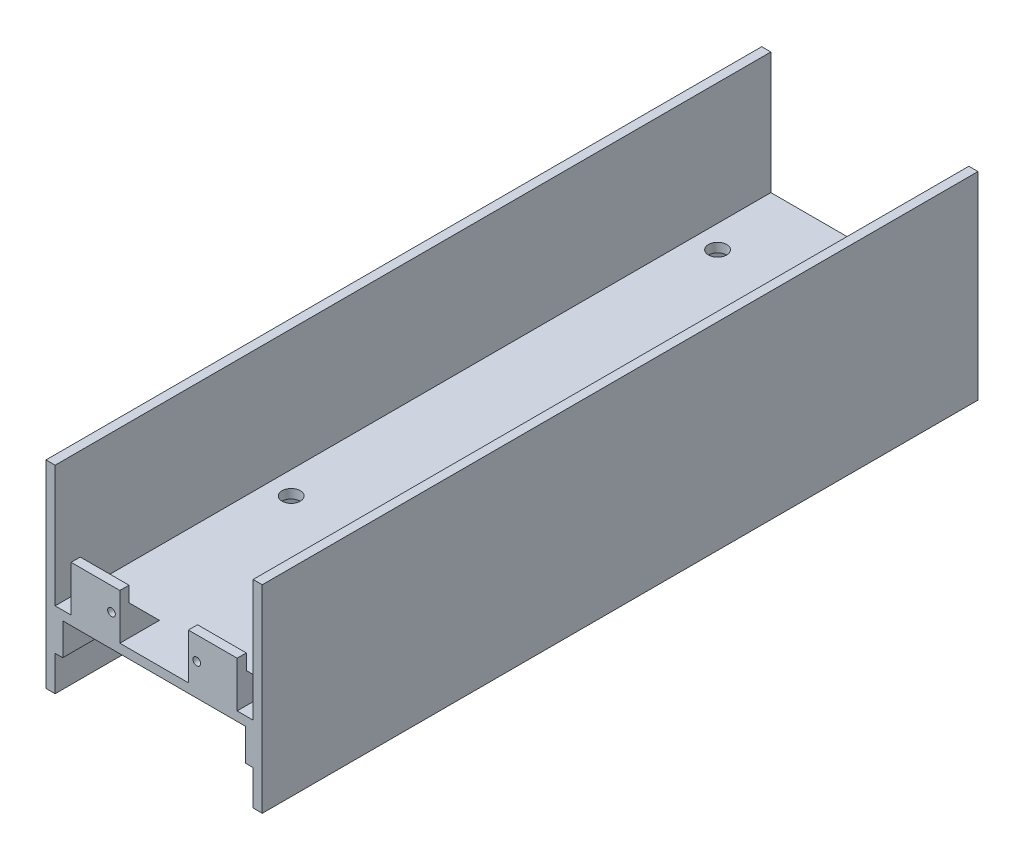
ISO-10303-21;
HEADER;
FILE_DESCRIPTION(('STEP AP214'),'2;1');
FILE_NAME('part.step','',(''),(''),'','','');
FILE_SCHEMA(('AUTOMOTIVE_DESIGN { 1 0 10303 214 1 1 1 1 }'));
ENDSEC;
DATA;
#1=APPLICATION_CONTEXT('core data for automotive mechanical design processes');
#2=APPLICATION_PROTOCOL_DEFINITION('international standard','automotive_design',2000,#1);
#3=PRODUCT_CONTEXT('',#1,'mechanical');
#4=PRODUCT('Part','Part','',(#3));
#5=PRODUCT_RELATED_PRODUCT_CATEGORY('part','',(#4));
#6=PRODUCT_DEFINITION_FORMATION('','',#4);
#7=PRODUCT_DEFINITION_CONTEXT('part definition',#1,'design');
#8=PRODUCT_DEFINITION('design','',#6,#7);
#9=PRODUCT_DEFINITION_SHAPE('','',#8);
#10=(LENGTH_UNIT() NAMED_UNIT(*) SI_UNIT(.MILLI.,.METRE.));
#11=(NAMED_UNIT(*) PLANE_ANGLE_UNIT() SI_UNIT($,.RADIAN.));
#12=(NAMED_UNIT(*) SI_UNIT($,.STERADIAN.) SOLID_ANGLE_UNIT());
#13=UNCERTAINTY_MEASURE_WITH_UNIT(LENGTH_MEASURE(1.E-05),#10,'distance_accuracy_value','');
#14=(GEOMETRIC_REPRESENTATION_CONTEXT(3) GLOBAL_UNCERTAINTY_ASSIGNED_CONTEXT((#13)) GLOBAL_UNIT_ASSIGNED_CONTEXT((#10,
#11,#12)) REPRESENTATION_CONTEXT('',''));
#15=CARTESIAN_POINT('',(0.,0.,0.));
#16=DIRECTION('',(0.,0.,1.));
#17=DIRECTION('',(1.,0.,0.));
#18=AXIS2_PLACEMENT_3D('',#15,#16,#17);
#19=CARTESIAN_POINT('',(-32.5,26.5,82.));
#20=DIRECTION('',(0.,-1.,0.));
#21=DIRECTION('',(0.,0.,-1.));
#22=AXIS2_PLACEMENT_3D('',#19,#20,#21);
#23=PLANE('',#22);
#24=CARTESIAN_POINT('',(-25.,26.5,12.));
#25=DIRECTION('',(0.,1.,0.));
#26=DIRECTION('',(0.,0.,1.));
#27=AXIS2_PLACEMENT_3D('',#24,#25,#26);
#28=CIRCLE('',#27,3.);
#29=CARTESIAN_POINT('',(-25.,26.5,15.));
#30=VERTEX_POINT('',#29);
#31=EDGE_CURVE('E859',#30,#30,#28,.T.);
#32=ORIENTED_EDGE('',*,*,#31,.F.);
#33=EDGE_LOOP('',(#32));
#34=FACE_BOUND('',#33,.T.);
#35=CARTESIAN_POINT('',(25.,26.5,12.));
#36=DIRECTION('',(0.,1.,0.));
#37=DIRECTION('',(0.,0.,1.));
#38=AXIS2_PLACEMENT_3D('',#35,#36,#37);
#39=CIRCLE('',#38,3.);
#40=CARTESIAN_POINT('',(25.,26.5,15.));
#41=VERTEX_POINT('',#40);
#42=EDGE_CURVE('E855',#41,#41,#39,.T.);
#43=ORIENTED_EDGE('',*,*,#42,.F.);
#44=EDGE_LOOP('',(#43));
#45=FACE_BOUND('',#44,.T.);
#46=CARTESIAN_POINT('',(25.,26.5,-128.));
#47=DIRECTION('',(0.,1.,0.));
#48=DIRECTION('',(0.,0.,1.));
#49=AXIS2_PLACEMENT_3D('',#46,#47,#48);
#50=CIRCLE('',#49,3.);
#51=CARTESIAN_POINT('',(25.,26.5,-125.));
#52=VERTEX_POINT('',#51);
#53=EDGE_CURVE('E603',#52,#52,#50,.T.);
#54=ORIENTED_EDGE('',*,*,#53,.F.);
#55=EDGE_LOOP('',(#54));
#56=FACE_BOUND('',#55,.T.);
#57=CARTESIAN_POINT('',(-25.,26.5,-128.));
#58=DIRECTION('',(0.,1.,0.));
#59=DIRECTION('',(0.,0.,1.));
#60=AXIS2_PLACEMENT_3D('',#57,#58,#59);
#61=CIRCLE('',#60,3.);
#62=CARTESIAN_POINT('',(-25.,26.5,-125.));
#63=VERTEX_POINT('',#62);
#64=EDGE_CURVE('E407',#63,#63,#61,.T.);
#65=ORIENTED_EDGE('',*,*,#64,.F.);
#66=EDGE_LOOP('',(#65));
#67=FACE_BOUND('',#66,.T.);
#68=DIRECTION('',(0.,0.,1.));
#69=VECTOR('',#68,1.);
#70=CARTESIAN_POINT('',(11.25,26.5,82.));
#71=LINE('',#70,#69);
#72=CARTESIAN_POINT('',(11.25,26.5,69.));
#73=VERTEX_POINT('',#72);
#74=CARTESIAN_POINT('',(11.25,26.5,82.));
#75=VERTEX_POINT('',#74);
#76=EDGE_CURVE('E236',#73,#75,#71,.T.);
#77=ORIENTED_EDGE('',*,*,#76,.F.);
#78=DIRECTION('',(1.,0.,0.));
#79=VECTOR('',#78,1.);
#80=CARTESIAN_POINT('',(27.25,26.5,69.));
#81=LINE('',#80,#79);
#82=CARTESIAN_POINT('',(27.25,26.5,69.));
#83=VERTEX_POINT('',#82);
#84=EDGE_CURVE('E386',#73,#83,#81,.T.);
#85=ORIENTED_EDGE('',*,*,#84,.T.);
#86=DIRECTION('',(0.,0.,-1.));
#87=VECTOR('',#86,1.);
#88=CARTESIAN_POINT('',(27.25,26.5,79.));
#89=LINE('',#88,#87);
#90=CARTESIAN_POINT('',(27.25,26.5,82.));
#91=VERTEX_POINT('',#90);
#92=EDGE_CURVE('E232',#91,#83,#89,.T.);
#93=ORIENTED_EDGE('',*,*,#92,.F.);
#94=DIRECTION('',(-1.,0.,0.));
#95=VECTOR('',#94,1.);
#96=CARTESIAN_POINT('',(-32.5,26.5,82.));
#97=LINE('',#96,#95);
#98=CARTESIAN_POINT('',(32.5,26.5,82.));
#99=VERTEX_POINT('',#98);
#100=EDGE_CURVE('E339',#99,#91,#97,.T.);
#101=ORIENTED_EDGE('',*,*,#100,.F.);
#102=DIRECTION('',(0.,0.,-1.));
#103=VECTOR('',#102,1.);
#104=CARTESIAN_POINT('',(32.5,26.5,82.));
#105=LINE('',#104,#103);
#106=CARTESIAN_POINT('',(32.5,26.5,-153.));
#107=VERTEX_POINT('',#106);
#108=EDGE_CURVE('E356',#99,#107,#105,.T.);
#109=ORIENTED_EDGE('',*,*,#108,.T.);
#110=DIRECTION('',(-1.,0.,0.));
#111=VECTOR('',#110,1.);
#112=CARTESIAN_POINT('',(-32.5,26.5,-153.));
#113=LINE('',#112,#111);
#114=CARTESIAN_POINT('',(-32.5,26.5,-153.));
#115=VERTEX_POINT('',#114);
#116=EDGE_CURVE('E302',#107,#115,#113,.T.);
#117=ORIENTED_EDGE('',*,*,#116,.T.);
#118=DIRECTION('',(0.,0.,-1.));
#119=VECTOR('',#118,1.);
#120=CARTESIAN_POINT('',(-32.5,26.5,82.));
#121=LINE('',#120,#119);
#122=CARTESIAN_POINT('',(-32.5,26.5,82.));
#123=VERTEX_POINT('',#122);
#124=EDGE_CURVE('E354',#123,#115,#121,.T.);
#125=ORIENTED_EDGE('',*,*,#124,.F.);
#126=CARTESIAN_POINT('',(-27.25,26.5,82.));
#127=VERTEX_POINT('',#126);
#128=EDGE_CURVE('E338',#127,#123,#97,.T.);
#129=ORIENTED_EDGE('',*,*,#128,.F.);
#130=DIRECTION('',(0.,0.,1.));
#131=VECTOR('',#130,1.);
#132=CARTESIAN_POINT('',(-27.25,26.5,79.));
#133=LINE('',#132,#131);
#134=CARTESIAN_POINT('',(-27.25,26.5,69.));
#135=VERTEX_POINT('',#134);
#136=EDGE_CURVE('E237',#135,#127,#133,.T.);
#137=ORIENTED_EDGE('',*,*,#136,.F.);
#138=DIRECTION('',(1.,0.,0.));
#139=VECTOR('',#138,1.);
#140=CARTESIAN_POINT('',(-11.25,26.5,69.));
#141=LINE('',#140,#139);
#142=CARTESIAN_POINT('',(-11.25,26.5,69.));
#143=VERTEX_POINT('',#142);
#144=EDGE_CURVE('E383',#135,#143,#141,.T.);
#145=ORIENTED_EDGE('',*,*,#144,.T.);
#146=DIRECTION('',(0.,0.,-1.));
#147=VECTOR('',#146,1.);
#148=CARTESIAN_POINT('',(-11.25,26.5,82.));
#149=LINE('',#148,#147);
#150=CARTESIAN_POINT('',(-11.25,26.5,82.));
#151=VERTEX_POINT('',#150);
#152=EDGE_CURVE('E239',#151,#143,#149,.T.);
#153=ORIENTED_EDGE('',*,*,#152,.F.);
#154=EDGE_CURVE('E342',#75,#151,#97,.T.);
#155=ORIENTED_EDGE('',*,*,#154,.F.);
#156=EDGE_LOOP('',(#77,#85,#93,#101,#109,#117,#125,#129,#137,#145,#153,#155));
#157=FACE_BOUND('',#156,.T.);
#158=ADVANCED_FACE('F35',(#34,#45,#56,#67,#157),#23,.F.);
#159=CARTESIAN_POINT('',(-32.5,1.5,82.));
#160=DIRECTION('',(0.,1.,0.));
#161=DIRECTION('',(-1.,0.,0.));
#162=AXIS2_PLACEMENT_3D('',#159,#160,#161);
#163=PLANE('',#162);
#164=DIRECTION('',(0.,0.,-1.));
#165=VECTOR('',#164,1.);
#166=CARTESIAN_POINT('',(-35.5,1.5,82.));
#167=LINE('',#166,#165);
#168=CARTESIAN_POINT('',(-35.5,1.5,82.));
#169=VERTEX_POINT('',#168);
#170=CARTESIAN_POINT('',(-35.5,1.5,-153.));
#171=VERTEX_POINT('',#170);
#172=EDGE_CURVE('E348',#169,#171,#167,.T.);
#173=ORIENTED_EDGE('',*,*,#172,.T.);
#174=DIRECTION('',(1.,0.,0.));
#175=VECTOR('',#174,1.);
#176=CARTESIAN_POINT('',(-32.5,1.5,-153.));
#177=LINE('',#176,#175);
#178=CARTESIAN_POINT('',(-32.5,1.5,-153.));
#179=VERTEX_POINT('',#178);
#180=EDGE_CURVE('E266',#171,#179,#177,.T.);
#181=ORIENTED_EDGE('',*,*,#180,.T.);
#182=DIRECTION('',(0.,0.,-1.));
#183=VECTOR('',#182,1.);
#184=CARTESIAN_POINT('',(-32.5,1.5,82.));
#185=LINE('',#184,#183);
#186=CARTESIAN_POINT('',(-32.5,1.5,82.));
#187=VERTEX_POINT('',#186);
#188=EDGE_CURVE('E378',#187,#179,#185,.T.);
#189=ORIENTED_EDGE('',*,*,#188,.F.);
#190=DIRECTION('',(1.,0.,0.));
#191=VECTOR('',#190,1.);
#192=CARTESIAN_POINT('',(-32.5,1.5,82.));
#193=LINE('',#192,#191);
#194=EDGE_CURVE('E314',#169,#187,#193,.T.);
#195=ORIENTED_EDGE('',*,*,#194,.F.);
#196=EDGE_LOOP('',(#173,#181,#189,#195));
#197=FACE_BOUND('',#196,.T.);
#198=ADVANCED_FACE('F468',(#197),#163,.F.);
#199=CARTESIAN_POINT('',(-32.5,13.,82.));
#200=DIRECTION('',(-1.,0.,0.));
#201=DIRECTION('',(0.,0.,1.));
#202=AXIS2_PLACEMENT_3D('',#199,#200,#201);
#203=PLANE('',#202);
#204=ORIENTED_EDGE('',*,*,#188,.T.);
#205=DIRECTION('',(0.,1.,0.));
#206=VECTOR('',#205,1.);
#207=CARTESIAN_POINT('',(-32.5,13.,-153.));
#208=LINE('',#207,#206);
#209=CARTESIAN_POINT('',(-32.5,13.,-153.));
#210=VERTEX_POINT('',#209);
#211=EDGE_CURVE('E269',#179,#210,#208,.T.);
#212=ORIENTED_EDGE('',*,*,#211,.T.);
#213=DIRECTION('',(0.,0.,-1.));
#214=VECTOR('',#213,1.);
#215=CARTESIAN_POINT('',(-32.5,13.,82.));
#216=LINE('',#215,#214);
#217=CARTESIAN_POINT('',(-32.5,13.,82.));
#218=VERTEX_POINT('',#217);
#219=EDGE_CURVE('E376',#218,#210,#216,.T.);
#220=ORIENTED_EDGE('',*,*,#219,.F.);
#221=DIRECTION('',(0.,1.,0.));
#222=VECTOR('',#221,1.);
#223=CARTESIAN_POINT('',(-32.5,13.,82.));
#224=LINE('',#223,#222);
#225=EDGE_CURVE('E316',#187,#218,#224,.T.);
#226=ORIENTED_EDGE('',*,*,#225,.F.);
#227=EDGE_LOOP('',(#204,#212,#220,#226));
#228=FACE_BOUND('',#227,.T.);
#229=ADVANCED_FACE('F471',(#228),#203,.F.);
#230=CARTESIAN_POINT('',(-32.5,13.,82.));
#231=DIRECTION('',(0.,1.,0.));
#232=DIRECTION('',(0.,0.,1.));
#233=AXIS2_PLACEMENT_3D('',#230,#231,#232);
#234=PLANE('',#233);
#235=ORIENTED_EDGE('',*,*,#219,.T.);
#236=DIRECTION('',(1.,0.,0.));
#237=VECTOR('',#236,1.);
#238=CARTESIAN_POINT('',(-32.5,13.,-153.));
#239=LINE('',#238,#237);
#240=CARTESIAN_POINT('',(-30.,13.,-153.));
#241=VERTEX_POINT('',#240);
#242=EDGE_CURVE('E272',#210,#241,#239,.T.);
#243=ORIENTED_EDGE('',*,*,#242,.T.);
#244=DIRECTION('',(0.,0.,-1.));
#245=VECTOR('',#244,1.);
#246=CARTESIAN_POINT('',(-30.,13.,82.));
#247=LINE('',#246,#245);
#248=CARTESIAN_POINT('',(-30.,13.,82.));
#249=VERTEX_POINT('',#248);
#250=EDGE_CURVE('E374',#249,#241,#247,.T.);
#251=ORIENTED_EDGE('',*,*,#250,.F.);
#252=DIRECTION('',(1.,0.,0.));
#253=VECTOR('',#252,1.);
#254=CARTESIAN_POINT('',(-32.5,13.,82.));
#255=LINE('',#254,#253);
#256=EDGE_CURVE('E318',#218,#249,#255,.T.);
#257=ORIENTED_EDGE('',*,*,#256,.F.);
#258=EDGE_LOOP('',(#235,#243,#251,#257));
#259=FACE_BOUND('',#258,.T.);
#260=ADVANCED_FACE('F480',(#259),#234,.F.);
#261=CARTESIAN_POINT('',(-30.,13.,82.));
#262=DIRECTION('',(-1.,0.,0.));
#263=DIRECTION('',(0.,-1.,0.));
#264=AXIS2_PLACEMENT_3D('',#261,#262,#263);
#265=PLANE('',#264);
#266=ORIENTED_EDGE('',*,*,#250,.T.);
#267=DIRECTION('',(0.,1.,0.));
#268=VECTOR('',#267,1.);
#269=CARTESIAN_POINT('',(-30.,13.,-153.));
#270=LINE('',#269,#268);
#271=CARTESIAN_POINT('',(-30.,23.5,-153.));
#272=VERTEX_POINT('',#271);
#273=EDGE_CURVE('E275',#241,#272,#270,.T.);
#274=ORIENTED_EDGE('',*,*,#273,.T.);
#275=DIRECTION('',(0.,0.,-1.));
#276=VECTOR('',#275,1.);
#277=CARTESIAN_POINT('',(-30.,23.5,82.));
#278=LINE('',#277,#276);
#279=CARTESIAN_POINT('',(-30.,23.5,82.));
#280=VERTEX_POINT('',#279);
#281=EDGE_CURVE('E372',#280,#272,#278,.T.);
#282=ORIENTED_EDGE('',*,*,#281,.F.);
#283=DIRECTION('',(0.,1.,0.));
#284=VECTOR('',#283,1.);
#285=CARTESIAN_POINT('',(-30.,13.,82.));
#286=LINE('',#285,#284);
#287=EDGE_CURVE('E320',#249,#280,#286,.T.);
#288=ORIENTED_EDGE('',*,*,#287,.F.);
#289=EDGE_LOOP('',(#266,#274,#282,#288));
#290=FACE_BOUND('',#289,.T.);
#291=ADVANCED_FACE('F487',(#290),#265,.F.);
#292=CARTESIAN_POINT('',(-30.,23.5,82.));
#293=DIRECTION('',(0.,1.,0.));
#294=DIRECTION('',(0.,0.,1.));
#295=AXIS2_PLACEMENT_3D('',#292,#293,#294);
#296=PLANE('',#295);
#297=CARTESIAN_POINT('',(-25.,23.5,12.));
#298=DIRECTION('',(0.,1.,0.));
#299=DIRECTION('',(0.,0.,1.));
#300=AXIS2_PLACEMENT_3D('',#297,#298,#299);
#301=CIRCLE('',#300,3.);
#302=CARTESIAN_POINT('',(-25.,23.5,15.));
#303=VERTEX_POINT('',#302);
#304=EDGE_CURVE('E40',#303,#303,#301,.T.);
#305=ORIENTED_EDGE('',*,*,#304,.T.);
#306=EDGE_LOOP('',(#305));
#307=FACE_BOUND('',#306,.T.);
#308=CARTESIAN_POINT('',(25.,23.5,12.));
#309=DIRECTION('',(0.,1.,0.));
#310=DIRECTION('',(0.,0.,1.));
#311=AXIS2_PLACEMENT_3D('',#308,#309,#310);
#312=CIRCLE('',#311,3.);
#313=CARTESIAN_POINT('',(25.,23.5,15.));
#314=VERTEX_POINT('',#313);
#315=EDGE_CURVE('E409',#314,#314,#312,.T.);
#316=ORIENTED_EDGE('',*,*,#315,.T.);
#317=EDGE_LOOP('',(#316));
#318=FACE_BOUND('',#317,.T.);
#319=CARTESIAN_POINT('',(25.,23.5,-128.));
#320=DIRECTION('',(0.,1.,0.));
#321=DIRECTION('',(0.,0.,1.));
#322=AXIS2_PLACEMENT_3D('',#319,#320,#321);
#323=CIRCLE('',#322,3.);
#324=CARTESIAN_POINT('',(25.,23.5,-125.));
#325=VERTEX_POINT('',#324);
#326=EDGE_CURVE('E406',#325,#325,#323,.T.);
#327=ORIENTED_EDGE('',*,*,#326,.T.);
#328=EDGE_LOOP('',(#327));
#329=FACE_BOUND('',#328,.T.);
#330=CARTESIAN_POINT('',(-25.,23.5,-128.));
#331=DIRECTION('',(0.,1.,0.));
#332=DIRECTION('',(0.,0.,1.));
#333=AXIS2_PLACEMENT_3D('',#330,#331,#332);
#334=CIRCLE('',#333,3.);
#335=CARTESIAN_POINT('',(-25.,23.5,-125.));
#336=VERTEX_POINT('',#335);
#337=EDGE_CURVE('E403',#336,#336,#334,.T.);
#338=ORIENTED_EDGE('',*,*,#337,.T.);
#339=EDGE_LOOP('',(#338));
#340=FACE_BOUND('',#339,.T.);
#341=ORIENTED_EDGE('',*,*,#281,.T.);
#342=DIRECTION('',(1.,0.,0.));
#343=VECTOR('',#342,1.);
#344=CARTESIAN_POINT('',(-30.,23.5,-153.));
#345=LINE('',#344,#343);
#346=CARTESIAN_POINT('',(30.,23.5,-153.));
#347=VERTEX_POINT('',#346);
#348=EDGE_CURVE('E278',#272,#347,#345,.T.);
#349=ORIENTED_EDGE('',*,*,#348,.T.);
#350=DIRECTION('',(0.,0.,-1.));
#351=VECTOR('',#350,1.);
#352=CARTESIAN_POINT('',(30.,23.5,82.));
#353=LINE('',#352,#351);
#354=CARTESIAN_POINT('',(30.,23.5,82.));
#355=VERTEX_POINT('',#354);
#356=EDGE_CURVE('E370',#355,#347,#353,.T.);
#357=ORIENTED_EDGE('',*,*,#356,.F.);
#358=DIRECTION('',(1.,0.,0.));
#359=VECTOR('',#358,1.);
#360=CARTESIAN_POINT('',(-30.,23.5,82.));
#361=LINE('',#360,#359);
#362=EDGE_CURVE('E322',#280,#355,#361,.T.);
#363=ORIENTED_EDGE('',*,*,#362,.F.);
#364=EDGE_LOOP('',(#341,#349,#357,#363));
#365=FACE_BOUND('',#364,.T.);
#366=ADVANCED_FACE('F489',(#307,#318,#329,#340,#365),#296,.F.);
#367=CARTESIAN_POINT('',(30.,13.,82.));
#368=DIRECTION('',(1.,0.,0.));
#369=DIRECTION('',(0.,1.,0.));
#370=AXIS2_PLACEMENT_3D('',#367,#368,#369);
#371=PLANE('',#370);
#372=ORIENTED_EDGE('',*,*,#356,.T.);
#373=DIRECTION('',(0.,-1.,0.));
#374=VECTOR('',#373,1.);
#375=CARTESIAN_POINT('',(30.,13.,-153.));
#376=LINE('',#375,#374);
#377=CARTESIAN_POINT('',(30.,13.,-153.));
#378=VERTEX_POINT('',#377);
#379=EDGE_CURVE('E281',#347,#378,#376,.T.);
#380=ORIENTED_EDGE('',*,*,#379,.T.);
#381=DIRECTION('',(0.,0.,-1.));
#382=VECTOR('',#381,1.);
#383=CARTESIAN_POINT('',(30.,13.,82.));
#384=LINE('',#383,#382);
#385=CARTESIAN_POINT('',(30.,13.,82.));
#386=VERTEX_POINT('',#385);
#387=EDGE_CURVE('E368',#386,#378,#384,.T.);
#388=ORIENTED_EDGE('',*,*,#387,.F.);
#389=DIRECTION('',(0.,-1.,0.));
#390=VECTOR('',#389,1.);
#391=CARTESIAN_POINT('',(30.,13.,82.));
#392=LINE('',#391,#390);
#393=EDGE_CURVE('E324',#355,#386,#392,.T.);
#394=ORIENTED_EDGE('',*,*,#393,.F.);
#395=EDGE_LOOP('',(#372,#380,#388,#394));
#396=FACE_BOUND('',#395,.T.);
#397=ADVANCED_FACE('F494',(#396),#371,.F.);
#398=CARTESIAN_POINT('',(32.5,13.,82.));
#399=DIRECTION('',(0.,1.,0.));
#400=DIRECTION('',(0.,0.,1.));
#401=AXIS2_PLACEMENT_3D('',#398,#399,#400);
#402=PLANE('',#401);
#403=ORIENTED_EDGE('',*,*,#387,.T.);
#404=DIRECTION('',(1.,0.,0.));
#405=VECTOR('',#404,1.);
#406=CARTESIAN_POINT('',(32.5,13.,-153.));
#407=LINE('',#406,#405);
#408=CARTESIAN_POINT('',(32.5,13.,-153.));
#409=VERTEX_POINT('',#408);
#410=EDGE_CURVE('E284',#378,#409,#407,.T.);
#411=ORIENTED_EDGE('',*,*,#410,.T.);
#412=DIRECTION('',(0.,0.,-1.));
#413=VECTOR('',#412,1.);
#414=CARTESIAN_POINT('',(32.5,13.,82.));
#415=LINE('',#414,#413);
#416=CARTESIAN_POINT('',(32.5,13.,82.));
#417=VERTEX_POINT('',#416);
#418=EDGE_CURVE('E366',#417,#409,#415,.T.);
#419=ORIENTED_EDGE('',*,*,#418,.F.);
#420=DIRECTION('',(1.,0.,0.));
#421=VECTOR('',#420,1.);
#422=CARTESIAN_POINT('',(32.5,13.,82.));
#423=LINE('',#422,#421);
#424=EDGE_CURVE('E326',#386,#417,#423,.T.);
#425=ORIENTED_EDGE('',*,*,#424,.F.);
#426=EDGE_LOOP('',(#403,#411,#419,#425));
#427=FACE_BOUND('',#426,.T.);
#428=ADVANCED_FACE('F500',(#427),#402,.F.);
#429=CARTESIAN_POINT('',(32.5,13.,82.));
#430=DIRECTION('',(1.,0.,0.));
#431=DIRECTION('',(0.,0.,-1.));
#432=AXIS2_PLACEMENT_3D('',#429,#430,#431);
#433=PLANE('',#432);
#434=ORIENTED_EDGE('',*,*,#418,.T.);
#435=DIRECTION('',(0.,-1.,0.));
#436=VECTOR('',#435,1.);
#437=CARTESIAN_POINT('',(32.5,13.,-153.));
#438=LINE('',#437,#436);
#439=CARTESIAN_POINT('',(32.5,1.5,-153.));
#440=VERTEX_POINT('',#439);
#441=EDGE_CURVE('E287',#409,#440,#438,.T.);
#442=ORIENTED_EDGE('',*,*,#441,.T.);
#443=DIRECTION('',(0.,0.,-1.));
#444=VECTOR('',#443,1.);
#445=CARTESIAN_POINT('',(32.5,1.5,82.));
#446=LINE('',#445,#444);
#447=CARTESIAN_POINT('',(32.5,1.5,82.));
#448=VERTEX_POINT('',#447);
#449=EDGE_CURVE('E364',#448,#440,#446,.T.);
#450=ORIENTED_EDGE('',*,*,#449,.F.);
#451=DIRECTION('',(0.,-1.,0.));
#452=VECTOR('',#451,1.);
#453=CARTESIAN_POINT('',(32.5,13.,82.));
#454=LINE('',#453,#452);
#455=EDGE_CURVE('E328',#417,#448,#454,.T.);
#456=ORIENTED_EDGE('',*,*,#455,.F.);
#457=EDGE_LOOP('',(#434,#442,#450,#456));
#458=FACE_BOUND('',#457,.T.);
#459=ADVANCED_FACE('F504',(#458),#433,.F.);
#460=CARTESIAN_POINT('',(32.5,1.5,82.));
#461=DIRECTION('',(0.,1.,0.));
#462=DIRECTION('',(-1.,0.,0.));
#463=AXIS2_PLACEMENT_3D('',#460,#461,#462);
#464=PLANE('',#463);
#465=ORIENTED_EDGE('',*,*,#449,.T.);
#466=DIRECTION('',(1.,0.,0.));
#467=VECTOR('',#466,1.);
#468=CARTESIAN_POINT('',(32.5,1.5,-153.));
#469=LINE('',#468,#467);
#470=CARTESIAN_POINT('',(35.5,1.5,-153.));
#471=VERTEX_POINT('',#470);
#472=EDGE_CURVE('E290',#440,#471,#469,.T.);
#473=ORIENTED_EDGE('',*,*,#472,.T.);
#474=DIRECTION('',(0.,0.,-1.));
#475=VECTOR('',#474,1.);
#476=CARTESIAN_POINT('',(35.5,1.5,82.));
#477=LINE('',#476,#475);
#478=CARTESIAN_POINT('',(35.5,1.5,82.));
#479=VERTEX_POINT('',#478);
#480=EDGE_CURVE('E362',#479,#471,#477,.T.);
#481=ORIENTED_EDGE('',*,*,#480,.F.);
#482=DIRECTION('',(1.,0.,0.));
#483=VECTOR('',#482,1.);
#484=CARTESIAN_POINT('',(32.5,1.5,82.));
#485=LINE('',#484,#483);
#486=EDGE_CURVE('E330',#448,#479,#485,.T.);
#487=ORIENTED_EDGE('',*,*,#486,.F.);
#488=EDGE_LOOP('',(#465,#473,#481,#487));
#489=FACE_BOUND('',#488,.T.);
#490=ADVANCED_FACE('F509',(#489),#464,.F.);
#491=CARTESIAN_POINT('',(35.5,26.5,82.));
#492=DIRECTION('',(-1.,0.,0.));
#493=DIRECTION('',(0.,-1.,0.));
#494=AXIS2_PLACEMENT_3D('',#491,#492,#493);
#495=PLANE('',#494);
#496=ORIENTED_EDGE('',*,*,#480,.T.);
#497=DIRECTION('',(0.,1.,0.));
#498=VECTOR('',#497,1.);
#499=CARTESIAN_POINT('',(35.5,1.5,-153.));
#500=LINE('',#499,#498);
#501=CARTESIAN_POINT('',(35.5,66.5,-153.));
#502=VERTEX_POINT('',#501);
#503=EDGE_CURVE('E293',#471,#502,#500,.T.);
#504=ORIENTED_EDGE('',*,*,#503,.T.);
#505=DIRECTION('',(0.,0.,-1.));
#506=VECTOR('',#505,1.);
#507=CARTESIAN_POINT('',(35.5,66.5,82.));
#508=LINE('',#507,#506);
#509=CARTESIAN_POINT('',(35.5,66.5,82.));
#510=VERTEX_POINT('',#509);
#511=EDGE_CURVE('E360',#510,#502,#508,.T.);
#512=ORIENTED_EDGE('',*,*,#511,.F.);
#513=DIRECTION('',(0.,1.,0.));
#514=VECTOR('',#513,1.);
#515=CARTESIAN_POINT('',(35.5,1.5,82.));
#516=LINE('',#515,#514);
#517=EDGE_CURVE('E332',#479,#510,#516,.T.);
#518=ORIENTED_EDGE('',*,*,#517,.F.);
#519=EDGE_LOOP('',(#496,#504,#512,#518));
#520=FACE_BOUND('',#519,.T.);
#521=ADVANCED_FACE('F515',(#520),#495,.F.);
#522=CARTESIAN_POINT('',(35.5,66.5,82.));
#523=DIRECTION('',(0.,-1.,0.));
#524=DIRECTION('',(0.,0.,-1.));
#525=AXIS2_PLACEMENT_3D('',#522,#523,#524);
#526=PLANE('',#525);
#527=ORIENTED_EDGE('',*,*,#511,.T.);
#528=DIRECTION('',(-1.,0.,0.));
#529=VECTOR('',#528,1.);
#530=CARTESIAN_POINT('',(35.5,66.5,-153.));
#531=LINE('',#530,#529);
#532=CARTESIAN_POINT('',(32.5,66.5,-153.));
#533=VERTEX_POINT('',#532);
#534=EDGE_CURVE('E296',#502,#533,#531,.T.);
#535=ORIENTED_EDGE('',*,*,#534,.T.);
#536=DIRECTION('',(0.,0.,-1.));
#537=VECTOR('',#536,1.);
#538=CARTESIAN_POINT('',(32.5,66.5,82.));
#539=LINE('',#538,#537);
#540=CARTESIAN_POINT('',(32.5,66.5,82.));
#541=VERTEX_POINT('',#540);
#542=EDGE_CURVE('E358',#541,#533,#539,.T.);
#543=ORIENTED_EDGE('',*,*,#542,.F.);
#544=DIRECTION('',(-1.,0.,0.));
#545=VECTOR('',#544,1.);
#546=CARTESIAN_POINT('',(35.5,66.5,82.));
#547=LINE('',#546,#545);
#548=EDGE_CURVE('E334',#510,#541,#547,.T.);
#549=ORIENTED_EDGE('',*,*,#548,.F.);
#550=EDGE_LOOP('',(#527,#535,#543,#549));
#551=FACE_BOUND('',#550,.T.);
#552=ADVANCED_FACE('F519',(#551),#526,.F.);
#553=CARTESIAN_POINT('',(32.5,66.5,82.));
#554=DIRECTION('',(1.,0.,0.));
#555=DIRECTION('',(0.,1.,0.));
#556=AXIS2_PLACEMENT_3D('',#553,#554,#555);
#557=PLANE('',#556);
#558=ORIENTED_EDGE('',*,*,#542,.T.);
#559=DIRECTION('',(0.,-1.,0.));
#560=VECTOR('',#559,1.);
#561=CARTESIAN_POINT('',(32.5,66.5,-153.));
#562=LINE('',#561,#560);
#563=EDGE_CURVE('E299',#533,#107,#562,.T.);
#564=ORIENTED_EDGE('',*,*,#563,.T.);
#565=ORIENTED_EDGE('',*,*,#108,.F.);
#566=DIRECTION('',(0.,-1.,0.));
#567=VECTOR('',#566,1.);
#568=CARTESIAN_POINT('',(32.5,66.5,82.));
#569=LINE('',#568,#567);
#570=EDGE_CURVE('E336',#541,#99,#569,.T.);
#571=ORIENTED_EDGE('',*,*,#570,.F.);
#572=EDGE_LOOP('',(#558,#564,#565,#571));
#573=FACE_BOUND('',#572,.T.);
#574=ADVANCED_FACE('F524',(#573),#557,.F.);
#575=CARTESIAN_POINT('',(-32.5,66.5,82.));
#576=DIRECTION('',(-1.,0.,0.));
#577=DIRECTION('',(0.,-1.,0.));
#578=AXIS2_PLACEMENT_3D('',#575,#576,#577);
#579=PLANE('',#578);
#580=ORIENTED_EDGE('',*,*,#124,.T.);
#581=DIRECTION('',(0.,1.,0.));
#582=VECTOR('',#581,1.);
#583=CARTESIAN_POINT('',(-32.5,66.5,-153.));
#584=LINE('',#583,#582);
#585=CARTESIAN_POINT('',(-32.5,66.5,-153.));
#586=VERTEX_POINT('',#585);
#587=EDGE_CURVE('E305',#115,#586,#584,.T.);
#588=ORIENTED_EDGE('',*,*,#587,.T.);
#589=DIRECTION('',(0.,0.,-1.));
#590=VECTOR('',#589,1.);
#591=CARTESIAN_POINT('',(-32.5,66.5,82.));
#592=LINE('',#591,#590);
#593=CARTESIAN_POINT('',(-32.5,66.5,82.));
#594=VERTEX_POINT('',#593);
#595=EDGE_CURVE('E352',#594,#586,#592,.T.);
#596=ORIENTED_EDGE('',*,*,#595,.F.);
#597=DIRECTION('',(0.,1.,0.));
#598=VECTOR('',#597,1.);
#599=CARTESIAN_POINT('',(-32.5,66.5,82.));
#600=LINE('',#599,#598);
#601=EDGE_CURVE('E341',#123,#594,#600,.T.);
#602=ORIENTED_EDGE('',*,*,#601,.F.);
#603=EDGE_LOOP('',(#580,#588,#596,#602));
#604=FACE_BOUND('',#603,.T.);
#605=ADVANCED_FACE('F453',(#604),#579,.F.);
#606=CARTESIAN_POINT('',(-35.5,66.5,82.));
#607=DIRECTION('',(0.,-1.,0.));
#608=DIRECTION('',(0.,0.,-1.));
#609=AXIS2_PLACEMENT_3D('',#606,#607,#608);
#610=PLANE('',#609);
#611=ORIENTED_EDGE('',*,*,#595,.T.);
#612=DIRECTION('',(-1.,0.,0.));
#613=VECTOR('',#612,1.);
#614=CARTESIAN_POINT('',(-35.5,66.5,-153.));
#615=LINE('',#614,#613);
#616=CARTESIAN_POINT('',(-35.5,66.5,-153.));
#617=VERTEX_POINT('',#616);
#618=EDGE_CURVE('E308',#586,#617,#615,.T.);
#619=ORIENTED_EDGE('',*,*,#618,.T.);
#620=DIRECTION('',(0.,0.,-1.));
#621=VECTOR('',#620,1.);
#622=CARTESIAN_POINT('',(-35.5,66.5,82.));
#623=LINE('',#622,#621);
#624=CARTESIAN_POINT('',(-35.5,66.5,82.));
#625=VERTEX_POINT('',#624);
#626=EDGE_CURVE('E350',#625,#617,#623,.T.);
#627=ORIENTED_EDGE('',*,*,#626,.F.);
#628=DIRECTION('',(-1.,0.,0.));
#629=VECTOR('',#628,1.);
#630=CARTESIAN_POINT('',(-35.5,66.5,82.));
#631=LINE('',#630,#629);
#632=EDGE_CURVE('E344',#594,#625,#631,.T.);
#633=ORIENTED_EDGE('',*,*,#632,.F.);
#634=EDGE_LOOP('',(#611,#619,#627,#633));
#635=FACE_BOUND('',#634,.T.);
#636=ADVANCED_FACE('F458',(#635),#610,.F.);
#637=CARTESIAN_POINT('',(-35.5,1.5,82.));
#638=DIRECTION('',(1.,0.,0.));
#639=DIRECTION('',(0.,1.,0.));
#640=AXIS2_PLACEMENT_3D('',#637,#638,#639);
#641=PLANE('',#640);
#642=ORIENTED_EDGE('',*,*,#626,.T.);
#643=DIRECTION('',(0.,-1.,0.));
#644=VECTOR('',#643,1.);
#645=CARTESIAN_POINT('',(-35.5,26.5,-153.));
#646=LINE('',#645,#644);
#647=EDGE_CURVE('E311',#617,#171,#646,.T.);
#648=ORIENTED_EDGE('',*,*,#647,.T.);
#649=ORIENTED_EDGE('',*,*,#172,.F.);
#650=DIRECTION('',(0.,-1.,0.));
#651=VECTOR('',#650,1.);
#652=CARTESIAN_POINT('',(-35.5,26.5,82.));
#653=LINE('',#652,#651);
#654=EDGE_CURVE('E346',#625,#169,#653,.T.);
#655=ORIENTED_EDGE('',*,*,#654,.F.);
#656=EDGE_LOOP('',(#642,#648,#649,#655));
#657=FACE_BOUND('',#656,.T.);
#658=ADVANCED_FACE('F464',(#657),#641,.F.);
#659=CARTESIAN_POINT('',(0.,0.,82.));
#660=DIRECTION('',(0.,0.,-1.));
#661=DIRECTION('',(-1.,0.,0.));
#662=AXIS2_PLACEMENT_3D('',#659,#660,#661);
#663=PLANE('',#662);
#664=CARTESIAN_POINT('',(-14.,33.95,82.));
#665=DIRECTION('',(0.,0.,1.));
#666=DIRECTION('',(1.,0.,0.));
#667=AXIS2_PLACEMENT_3D('',#664,#665,#666);
#668=CIRCLE('',#667,1.25);
#669=CARTESIAN_POINT('',(-12.75,33.95,82.));
#670=VERTEX_POINT('',#669);
#671=EDGE_CURVE('E400',#670,#670,#668,.T.);
#672=ORIENTED_EDGE('',*,*,#671,.F.);
#673=EDGE_LOOP('',(#672));
#674=FACE_BOUND('',#673,.T.);
#675=CARTESIAN_POINT('',(14.,33.95,82.));
#676=DIRECTION('',(0.,0.,1.));
#677=DIRECTION('',(1.,0.,0.));
#678=AXIS2_PLACEMENT_3D('',#675,#676,#677);
#679=CIRCLE('',#678,1.25);
#680=CARTESIAN_POINT('',(15.25,33.95,82.));
#681=VERTEX_POINT('',#680);
#682=EDGE_CURVE('E414',#681,#681,#679,.T.);
#683=ORIENTED_EDGE('',*,*,#682,.F.);
#684=EDGE_LOOP('',(#683));
#685=FACE_BOUND('',#684,.T.);
#686=ORIENTED_EDGE('',*,*,#194,.T.);
#687=ORIENTED_EDGE('',*,*,#225,.T.);
#688=ORIENTED_EDGE('',*,*,#256,.T.);
#689=ORIENTED_EDGE('',*,*,#287,.T.);
#690=ORIENTED_EDGE('',*,*,#362,.T.);
#691=ORIENTED_EDGE('',*,*,#393,.T.);
#692=ORIENTED_EDGE('',*,*,#424,.T.);
#693=ORIENTED_EDGE('',*,*,#455,.T.);
#694=ORIENTED_EDGE('',*,*,#486,.T.);
#695=ORIENTED_EDGE('',*,*,#517,.T.);
#696=ORIENTED_EDGE('',*,*,#548,.T.);
#697=ORIENTED_EDGE('',*,*,#570,.T.);
#698=ORIENTED_EDGE('',*,*,#100,.T.);
#699=DIRECTION('',(0.,-1.,0.));
#700=VECTOR('',#699,1.);
#701=CARTESIAN_POINT('',(27.25,41.5,82.));
#702=LINE('',#701,#700);
#703=CARTESIAN_POINT('',(27.25,41.5,82.));
#704=VERTEX_POINT('',#703);
#705=EDGE_CURVE('E219',#704,#91,#702,.T.);
#706=ORIENTED_EDGE('',*,*,#705,.F.);
#707=DIRECTION('',(1.,0.,0.));
#708=VECTOR('',#707,1.);
#709=CARTESIAN_POINT('',(27.25,41.5,82.));
#710=LINE('',#709,#708);
#711=CARTESIAN_POINT('',(11.25,41.5,82.));
#712=VERTEX_POINT('',#711);
#713=EDGE_CURVE('E211',#712,#704,#710,.T.);
#714=ORIENTED_EDGE('',*,*,#713,.F.);
#715=DIRECTION('',(0.,-1.,0.));
#716=VECTOR('',#715,1.);
#717=CARTESIAN_POINT('',(11.25,41.5,82.));
#718=LINE('',#717,#716);
#719=EDGE_CURVE('E216',#712,#75,#718,.T.);
#720=ORIENTED_EDGE('',*,*,#719,.T.);
#721=ORIENTED_EDGE('',*,*,#154,.T.);
#722=DIRECTION('',(0.,-1.,0.));
#723=VECTOR('',#722,1.);
#724=CARTESIAN_POINT('',(-11.25,41.5,82.));
#725=LINE('',#724,#723);
#726=CARTESIAN_POINT('',(-11.25,41.5,82.));
#727=VERTEX_POINT('',#726);
#728=EDGE_CURVE('E260',#727,#151,#725,.T.);
#729=ORIENTED_EDGE('',*,*,#728,.F.);
#730=DIRECTION('',(1.,0.,0.));
#731=VECTOR('',#730,1.);
#732=CARTESIAN_POINT('',(-27.25,41.5,82.));
#733=LINE('',#732,#731);
#734=CARTESIAN_POINT('',(-27.25,41.5,82.));
#735=VERTEX_POINT('',#734);
#736=EDGE_CURVE('E248',#735,#727,#733,.T.);
#737=ORIENTED_EDGE('',*,*,#736,.F.);
#738=DIRECTION('',(0.,-1.,0.));
#739=VECTOR('',#738,1.);
#740=CARTESIAN_POINT('',(-27.25,41.5,82.));
#741=LINE('',#740,#739);
#742=EDGE_CURVE('E263',#735,#127,#741,.T.);
#743=ORIENTED_EDGE('',*,*,#742,.T.);
#744=ORIENTED_EDGE('',*,*,#128,.T.);
#745=ORIENTED_EDGE('',*,*,#601,.T.);
#746=ORIENTED_EDGE('',*,*,#632,.T.);
#747=ORIENTED_EDGE('',*,*,#654,.T.);
#748=EDGE_LOOP('',(#686,#687,#688,#689,#690,#691,#692,#693,#694,#695,#696,#697,#698,#706,#714,
#720,#721,#729,#737,#743,#744,#745,#746,#747));
#749=FACE_BOUND('',#748,.T.);
#750=ADVANCED_FACE('F214',(#674,#685,#749),#663,.F.);
#751=CARTESIAN_POINT('',(0.,0.,-153.));
#752=DIRECTION('',(0.,0.,-1.));
#753=DIRECTION('',(-1.,0.,0.));
#754=AXIS2_PLACEMENT_3D('',#751,#752,#753);
#755=PLANE('',#754);
#756=ORIENTED_EDGE('',*,*,#180,.F.);
#757=ORIENTED_EDGE('',*,*,#647,.F.);
#758=ORIENTED_EDGE('',*,*,#618,.F.);
#759=ORIENTED_EDGE('',*,*,#587,.F.);
#760=ORIENTED_EDGE('',*,*,#116,.F.);
#761=ORIENTED_EDGE('',*,*,#563,.F.);
#762=ORIENTED_EDGE('',*,*,#534,.F.);
#763=ORIENTED_EDGE('',*,*,#503,.F.);
#764=ORIENTED_EDGE('',*,*,#472,.F.);
#765=ORIENTED_EDGE('',*,*,#441,.F.);
#766=ORIENTED_EDGE('',*,*,#410,.F.);
#767=ORIENTED_EDGE('',*,*,#379,.F.);
#768=ORIENTED_EDGE('',*,*,#348,.F.);
#769=ORIENTED_EDGE('',*,*,#273,.F.);
#770=ORIENTED_EDGE('',*,*,#242,.F.);
#771=ORIENTED_EDGE('',*,*,#211,.F.);
#772=EDGE_LOOP('',(#756,#757,#758,#759,#760,#761,#762,#763,#764,#765,#766,#767,#768,#769,#770,#771));
#773=FACE_BOUND('',#772,.T.);
#774=ADVANCED_FACE('F475',(#773),#755,.T.);
#775=CARTESIAN_POINT('',(-27.25,41.5,79.));
#776=DIRECTION('',(1.,0.,0.));
#777=DIRECTION('',(0.,0.,-1.));
#778=AXIS2_PLACEMENT_3D('',#775,#776,#777);
#779=PLANE('',#778);
#780=ORIENTED_EDGE('',*,*,#136,.T.);
#781=ORIENTED_EDGE('',*,*,#742,.F.);
#782=DIRECTION('',(0.,0.,1.));
#783=VECTOR('',#782,1.);
#784=CARTESIAN_POINT('',(-27.25,41.5,79.));
#785=LINE('',#784,#783);
#786=CARTESIAN_POINT('',(-27.25,41.5,79.));
#787=VERTEX_POINT('',#786);
#788=EDGE_CURVE('E245',#787,#735,#785,.T.);
#789=ORIENTED_EDGE('',*,*,#788,.F.);
#790=DIRECTION('',(0.,-1.,0.));
#791=VECTOR('',#790,1.);
#792=CARTESIAN_POINT('',(-27.25,41.5,79.));
#793=LINE('',#792,#791);
#794=CARTESIAN_POINT('',(-27.25,36.5000000000001,79.));
#795=VERTEX_POINT('',#794);
#796=EDGE_CURVE('E253',#787,#795,#793,.T.);
#797=ORIENTED_EDGE('',*,*,#796,.T.);
#798=DIRECTION('',(0.,0.707106781186551,0.707106781186544));
#799=VECTOR('',#798,1.);
#800=CARTESIAN_POINT('',(-27.25,39.0000000000001,81.5));
#801=LINE('',#800,#799);
#802=EDGE_CURVE('E45',#795,#135,#801,.F.);
#803=ORIENTED_EDGE('',*,*,#802,.T.);
#804=EDGE_LOOP('',(#780,#781,#789,#797,#803));
#805=FACE_BOUND('',#804,.T.);
#806=ADVANCED_FACE('F552',(#805),#779,.F.);
#807=CARTESIAN_POINT('',(-11.25,41.5,82.));
#808=DIRECTION('',(-1.,0.,0.));
#809=DIRECTION('',(0.,0.,1.));
#810=AXIS2_PLACEMENT_3D('',#807,#808,#809);
#811=PLANE('',#810);
#812=ORIENTED_EDGE('',*,*,#152,.T.);
#813=DIRECTION('',(0.,-0.707106781186551,-0.707106781186544));
#814=VECTOR('',#813,1.);
#815=CARTESIAN_POINT('',(-11.25,40.5000000000001,82.9999999999999));
#816=LINE('',#815,#814);
#817=CARTESIAN_POINT('',(-11.25,36.5000000000001,79.));
#818=VERTEX_POINT('',#817);
#819=EDGE_CURVE('E11',#143,#818,#816,.F.);
#820=ORIENTED_EDGE('',*,*,#819,.T.);
#821=DIRECTION('',(0.,-1.,0.));
#822=VECTOR('',#821,1.);
#823=CARTESIAN_POINT('',(-11.25,41.5,79.));
#824=LINE('',#823,#822);
#825=CARTESIAN_POINT('',(-11.25,41.5,79.));
#826=VERTEX_POINT('',#825);
#827=EDGE_CURVE('E258',#826,#818,#824,.T.);
#828=ORIENTED_EDGE('',*,*,#827,.F.);
#829=DIRECTION('',(0.,0.,-1.));
#830=VECTOR('',#829,1.);
#831=CARTESIAN_POINT('',(-11.25,41.5,82.));
#832=LINE('',#831,#830);
#833=EDGE_CURVE('E250',#727,#826,#832,.T.);
#834=ORIENTED_EDGE('',*,*,#833,.F.);
#835=ORIENTED_EDGE('',*,*,#728,.T.);
#836=EDGE_LOOP('',(#812,#820,#828,#834,#835));
#837=FACE_BOUND('',#836,.T.);
#838=ADVANCED_FACE('F555',(#837),#811,.F.);
#839=CARTESIAN_POINT('',(-11.25,41.5,79.));
#840=DIRECTION('',(0.,0.,1.));
#841=DIRECTION('',(1.,0.,0.));
#842=AXIS2_PLACEMENT_3D('',#839,#840,#841);
#843=PLANE('',#842);
#844=ORIENTED_EDGE('',*,*,#827,.T.);
#845=DIRECTION('',(-1.,0.,0.));
#846=VECTOR('',#845,1.);
#847=CARTESIAN_POINT('',(-27.25,36.5000000000001,79.));
#848=LINE('',#847,#846);
#849=EDGE_CURVE('E389',#818,#795,#848,.T.);
#850=ORIENTED_EDGE('',*,*,#849,.T.);
#851=ORIENTED_EDGE('',*,*,#796,.F.);
#852=DIRECTION('',(-1.,0.,0.));
#853=VECTOR('',#852,1.);
#854=CARTESIAN_POINT('',(-11.25,41.5,79.));
#855=LINE('',#854,#853);
#856=EDGE_CURVE('E252',#826,#787,#855,.T.);
#857=ORIENTED_EDGE('',*,*,#856,.F.);
#858=EDGE_LOOP('',(#844,#850,#851,#857));
#859=FACE_BOUND('',#858,.T.);
#860=ADVANCED_FACE('F559',(#859),#843,.F.);
#861=CARTESIAN_POINT('',(0.,41.5,0.));
#862=DIRECTION('',(0.,1.,0.));
#863=DIRECTION('',(0.,0.,1.));
#864=AXIS2_PLACEMENT_3D('',#861,#862,#863);
#865=PLANE('',#864);
#866=ORIENTED_EDGE('',*,*,#788,.T.);
#867=ORIENTED_EDGE('',*,*,#736,.T.);
#868=ORIENTED_EDGE('',*,*,#833,.T.);
#869=ORIENTED_EDGE('',*,*,#856,.T.);
#870=EDGE_LOOP('',(#866,#867,#868,#869));
#871=FACE_BOUND('',#870,.T.);
#872=ADVANCED_FACE('F562',(#871),#865,.T.);
#873=CARTESIAN_POINT('',(11.25,41.5,82.));
#874=DIRECTION('',(1.,0.,0.));
#875=DIRECTION('',(0.,0.,-1.));
#876=AXIS2_PLACEMENT_3D('',#873,#874,#875);
#877=PLANE('',#876);
#878=ORIENTED_EDGE('',*,*,#76,.T.);
#879=ORIENTED_EDGE('',*,*,#719,.F.);
#880=DIRECTION('',(0.,0.,1.));
#881=VECTOR('',#880,1.);
#882=CARTESIAN_POINT('',(11.25,41.5,82.));
#883=LINE('',#882,#881);
#884=CARTESIAN_POINT('',(11.25,41.5,79.));
#885=VERTEX_POINT('',#884);
#886=EDGE_CURVE('E223',#885,#712,#883,.T.);
#887=ORIENTED_EDGE('',*,*,#886,.F.);
#888=DIRECTION('',(0.,-1.,0.));
#889=VECTOR('',#888,1.);
#890=CARTESIAN_POINT('',(11.25,41.5,79.));
#891=LINE('',#890,#889);
#892=CARTESIAN_POINT('',(11.25,36.5000000000001,79.));
#893=VERTEX_POINT('',#892);
#894=EDGE_CURVE('E427',#885,#893,#891,.T.);
#895=ORIENTED_EDGE('',*,*,#894,.T.);
#896=DIRECTION('',(0.,0.707106781186551,0.707106781186544));
#897=VECTOR('',#896,1.);
#898=CARTESIAN_POINT('',(11.25,40.5000000000001,82.9999999999999));
#899=LINE('',#898,#897);
#900=EDGE_CURVE('E391',#893,#73,#899,.F.);
#901=ORIENTED_EDGE('',*,*,#900,.T.);
#902=EDGE_LOOP('',(#878,#879,#887,#895,#901));
#903=FACE_BOUND('',#902,.T.);
#904=ADVANCED_FACE('F234',(#903),#877,.F.);
#905=CARTESIAN_POINT('',(27.25,41.5,79.));
#906=DIRECTION('',(-1.,0.,0.));
#907=DIRECTION('',(0.,0.,1.));
#908=AXIS2_PLACEMENT_3D('',#905,#906,#907);
#909=PLANE('',#908);
#910=ORIENTED_EDGE('',*,*,#92,.T.);
#911=DIRECTION('',(0.,-0.707106781186551,-0.707106781186544));
#912=VECTOR('',#911,1.);
#913=CARTESIAN_POINT('',(27.25,39.0000000000001,81.5));
#914=LINE('',#913,#912);
#915=CARTESIAN_POINT('',(27.25,36.5000000000001,79.));
#916=VERTEX_POINT('',#915);
#917=EDGE_CURVE('E393',#83,#916,#914,.F.);
#918=ORIENTED_EDGE('',*,*,#917,.T.);
#919=DIRECTION('',(0.,-1.,0.));
#920=VECTOR('',#919,1.);
#921=CARTESIAN_POINT('',(27.25,41.5,79.));
#922=LINE('',#921,#920);
#923=CARTESIAN_POINT('',(27.25,41.5,79.));
#924=VERTEX_POINT('',#923);
#925=EDGE_CURVE('E241',#924,#916,#922,.T.);
#926=ORIENTED_EDGE('',*,*,#925,.F.);
#927=DIRECTION('',(0.,0.,-1.));
#928=VECTOR('',#927,1.);
#929=CARTESIAN_POINT('',(27.25,41.5,79.));
#930=LINE('',#929,#928);
#931=EDGE_CURVE('E222',#704,#924,#930,.T.);
#932=ORIENTED_EDGE('',*,*,#931,.F.);
#933=ORIENTED_EDGE('',*,*,#705,.T.);
#934=EDGE_LOOP('',(#910,#918,#926,#932,#933));
#935=FACE_BOUND('',#934,.T.);
#936=ADVANCED_FACE('F569',(#935),#909,.F.);
#937=CARTESIAN_POINT('',(11.25,41.5,79.));
#938=DIRECTION('',(0.,0.,1.));
#939=DIRECTION('',(1.,0.,0.));
#940=AXIS2_PLACEMENT_3D('',#937,#938,#939);
#941=PLANE('',#940);
#942=ORIENTED_EDGE('',*,*,#925,.T.);
#943=DIRECTION('',(-1.,0.,0.));
#944=VECTOR('',#943,1.);
#945=CARTESIAN_POINT('',(11.25,36.5000000000001,79.));
#946=LINE('',#945,#944);
#947=EDGE_CURVE('E380',#916,#893,#946,.T.);
#948=ORIENTED_EDGE('',*,*,#947,.T.);
#949=ORIENTED_EDGE('',*,*,#894,.F.);
#950=DIRECTION('',(-1.,0.,0.));
#951=VECTOR('',#950,1.);
#952=CARTESIAN_POINT('',(11.25,41.5,79.));
#953=LINE('',#952,#951);
#954=EDGE_CURVE('E228',#924,#885,#953,.T.);
#955=ORIENTED_EDGE('',*,*,#954,.F.);
#956=EDGE_LOOP('',(#942,#948,#949,#955));
#957=FACE_BOUND('',#956,.T.);
#958=ADVANCED_FACE('F434',(#957),#941,.F.);
#959=CARTESIAN_POINT('',(0.,41.5,0.));
#960=DIRECTION('',(0.,-1.,0.));
#961=DIRECTION('',(0.,0.,-1.));
#962=AXIS2_PLACEMENT_3D('',#959,#960,#961);
#963=PLANE('',#962);
#964=ORIENTED_EDGE('',*,*,#886,.T.);
#965=ORIENTED_EDGE('',*,*,#713,.T.);
#966=ORIENTED_EDGE('',*,*,#931,.T.);
#967=ORIENTED_EDGE('',*,*,#954,.T.);
#968=EDGE_LOOP('',(#964,#965,#966,#967));
#969=FACE_BOUND('',#968,.T.);
#970=ADVANCED_FACE('F226',(#969),#963,.F.);
#971=CARTESIAN_POINT('',(11.25,36.5000000000001,79.));
#972=DIRECTION('',(0.,0.707106781186544,-0.707106781186551));
#973=DIRECTION('',(1.,0.,0.));
#974=AXIS2_PLACEMENT_3D('',#971,#972,#973);
#975=PLANE('',#974);
#976=CARTESIAN_POINT('',(14.,33.95,76.45));
#977=DIRECTION('',(0.,0.707106781186544,-0.707106781186551));
#978=DIRECTION('',(0.,0.707106781186551,0.707106781186544));
#979=AXIS2_PLACEMENT_3D('',#976,#977,#978);
#980=ELLIPSE('',#979,1.76776695296636,1.25);
#981=CARTESIAN_POINT('',(14.,35.2,77.7));
#982=VERTEX_POINT('',#981);
#983=EDGE_CURVE('E399',#982,#982,#980,.F.);
#984=ORIENTED_EDGE('',*,*,#983,.T.);
#985=EDGE_LOOP('',(#984));
#986=FACE_BOUND('',#985,.T.);
#987=ORIENTED_EDGE('',*,*,#917,.F.);
#988=ORIENTED_EDGE('',*,*,#84,.F.);
#989=ORIENTED_EDGE('',*,*,#900,.F.);
#990=ORIENTED_EDGE('',*,*,#947,.F.);
#991=EDGE_LOOP('',(#987,#988,#989,#990));
#992=FACE_BOUND('',#991,.T.);
#993=ADVANCED_FACE('F438',(#986,#992),#975,.T.);
#994=CARTESIAN_POINT('',(-11.25,36.5000000000001,79.));
#995=DIRECTION('',(0.,0.707106781186544,-0.707106781186551));
#996=DIRECTION('',(1.,0.,0.));
#997=AXIS2_PLACEMENT_3D('',#994,#995,#996);
#998=PLANE('',#997);
#999=CARTESIAN_POINT('',(-14.,33.95,76.45));
#1000=DIRECTION('',(0.,0.707106781186544,-0.707106781186551));
#1001=DIRECTION('',(0.,0.707106781186551,0.707106781186544));
#1002=AXIS2_PLACEMENT_3D('',#999,#1000,#1001);
#1003=ELLIPSE('',#1002,1.76776695296636,1.25);
#1004=CARTESIAN_POINT('',(-14.,35.2,77.7));
#1005=VERTEX_POINT('',#1004);
#1006=EDGE_CURVE('E396',#1005,#1005,#1003,.F.);
#1007=ORIENTED_EDGE('',*,*,#1006,.T.);
#1008=EDGE_LOOP('',(#1007));
#1009=FACE_BOUND('',#1008,.T.);
#1010=ORIENTED_EDGE('',*,*,#819,.F.);
#1011=ORIENTED_EDGE('',*,*,#144,.F.);
#1012=ORIENTED_EDGE('',*,*,#802,.F.);
#1013=ORIENTED_EDGE('',*,*,#849,.F.);
#1014=EDGE_LOOP('',(#1010,#1011,#1012,#1013));
#1015=FACE_BOUND('',#1014,.T.);
#1016=ADVANCED_FACE('F38',(#1009,#1015),#998,.T.);
#1017=CARTESIAN_POINT('',(-14.,33.95,72.));
#1018=DIRECTION('',(0.,0.,1.));
#1019=DIRECTION('',(1.,0.,0.));
#1020=AXIS2_PLACEMENT_3D('',#1017,#1018,#1019);
#1021=CYLINDRICAL_SURFACE('',#1020,1.25);
#1022=ORIENTED_EDGE('',*,*,#671,.T.);
#1023=EDGE_LOOP('',(#1022));
#1024=FACE_BOUND('',#1023,.T.);
#1025=ORIENTED_EDGE('',*,*,#1006,.F.);
#1026=EDGE_LOOP('',(#1025));
#1027=FACE_BOUND('',#1026,.T.);
#1028=ADVANCED_FACE('F580',(#1024,#1027),#1021,.F.);
#1029=CARTESIAN_POINT('',(14.,33.95,72.));
#1030=DIRECTION('',(0.,0.,1.));
#1031=DIRECTION('',(1.,0.,0.));
#1032=AXIS2_PLACEMENT_3D('',#1029,#1030,#1031);
#1033=CYLINDRICAL_SURFACE('',#1032,1.25);
#1034=ORIENTED_EDGE('',*,*,#682,.T.);
#1035=EDGE_LOOP('',(#1034));
#1036=FACE_BOUND('',#1035,.T.);
#1037=ORIENTED_EDGE('',*,*,#983,.F.);
#1038=EDGE_LOOP('',(#1037));
#1039=FACE_BOUND('',#1038,.T.);
#1040=ADVANCED_FACE('F576',(#1036,#1039),#1033,.F.);
#1041=CARTESIAN_POINT('',(-25.,16.5,-128.));
#1042=DIRECTION('',(0.,1.,0.));
#1043=DIRECTION('',(0.,0.,1.));
#1044=AXIS2_PLACEMENT_3D('',#1041,#1042,#1043);
#1045=CYLINDRICAL_SURFACE('',#1044,3.);
#1046=ORIENTED_EDGE('',*,*,#64,.T.);
#1047=EDGE_LOOP('',(#1046));
#1048=FACE_BOUND('',#1047,.T.);
#1049=ORIENTED_EDGE('',*,*,#337,.F.);
#1050=EDGE_LOOP('',(#1049));
#1051=FACE_BOUND('',#1050,.T.);
#1052=ADVANCED_FACE('F579',(#1048,#1051),#1045,.F.);
#1053=CARTESIAN_POINT('',(25.,16.5,-128.));
#1054=DIRECTION('',(0.,1.,0.));
#1055=DIRECTION('',(0.,0.,1.));
#1056=AXIS2_PLACEMENT_3D('',#1053,#1054,#1055);
#1057=CYLINDRICAL_SURFACE('',#1056,3.);
#1058=ORIENTED_EDGE('',*,*,#53,.T.);
#1059=EDGE_LOOP('',(#1058));
#1060=FACE_BOUND('',#1059,.T.);
#1061=ORIENTED_EDGE('',*,*,#326,.F.);
#1062=EDGE_LOOP('',(#1061));
#1063=FACE_BOUND('',#1062,.T.);
#1064=ADVANCED_FACE('F586',(#1060,#1063),#1057,.F.);
#1065=CARTESIAN_POINT('',(25.,16.5,12.));
#1066=DIRECTION('',(0.,1.,0.));
#1067=DIRECTION('',(0.,0.,1.));
#1068=AXIS2_PLACEMENT_3D('',#1065,#1066,#1067);
#1069=CYLINDRICAL_SURFACE('',#1068,3.);
#1070=ORIENTED_EDGE('',*,*,#42,.T.);
#1071=EDGE_LOOP('',(#1070));
#1072=FACE_BOUND('',#1071,.T.);
#1073=ORIENTED_EDGE('',*,*,#315,.F.);
#1074=EDGE_LOOP('',(#1073));
#1075=FACE_BOUND('',#1074,.T.);
#1076=ADVANCED_FACE('F591',(#1072,#1075),#1069,.F.);
#1077=CARTESIAN_POINT('',(-25.,16.5,12.));
#1078=DIRECTION('',(0.,1.,0.));
#1079=DIRECTION('',(0.,0.,1.));
#1080=AXIS2_PLACEMENT_3D('',#1077,#1078,#1079);
#1081=CYLINDRICAL_SURFACE('',#1080,3.);
#1082=ORIENTED_EDGE('',*,*,#31,.T.);
#1083=EDGE_LOOP('',(#1082));
#1084=FACE_BOUND('',#1083,.T.);
#1085=ORIENTED_EDGE('',*,*,#304,.F.);
#1086=EDGE_LOOP('',(#1085));
#1087=FACE_BOUND('',#1086,.T.);
#1088=ADVANCED_FACE('F588',(#1084,#1087),#1081,.F.);
#1089=CLOSED_SHELL('',(#158,#198,#229,#260,#291,#366,#397,#428,#459,#490,#521,#552,#574,#605,
#636,#658,#750,#774,#806,#838,#860,#872,#904,#936,#958,#970,#993,#1016,#1028,#1040,#1052,#1064,
#1076,#1088));
#1090=MANIFOLD_SOLID_BREP('B2',#1089);
#1091=ADVANCED_BREP_SHAPE_REPRESENTATION('',(#18,#1090),#14);
#1092=SHAPE_DEFINITION_REPRESENTATION(#9,#1091);
ENDSEC;
END-ISO-10303-21;
